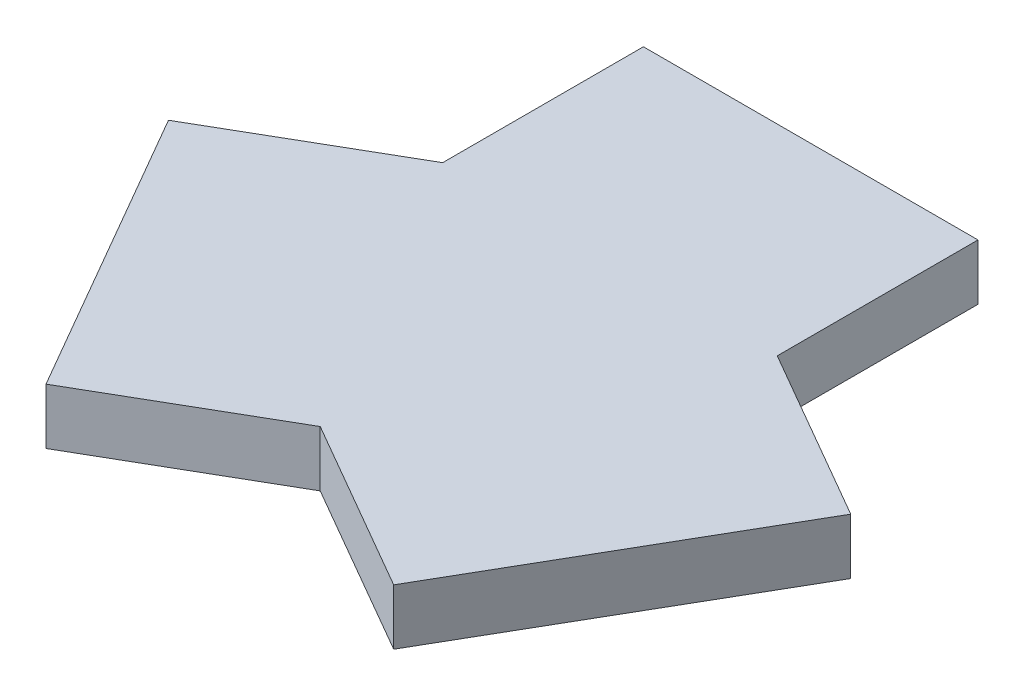
ISO-10303-21;
HEADER;
FILE_DESCRIPTION(('STEP AP214'),'2;1');
FILE_NAME('part.step','',(''),(''),'','','');
FILE_SCHEMA(('AUTOMOTIVE_DESIGN { 1 0 10303 214 1 1 1 1 }'));
ENDSEC;
DATA;
#1=APPLICATION_CONTEXT('core data for automotive mechanical design processes');
#2=APPLICATION_PROTOCOL_DEFINITION('international standard','automotive_design',2000,#1);
#3=PRODUCT_CONTEXT('',#1,'mechanical');
#4=PRODUCT('Part','Part','',(#3));
#5=PRODUCT_RELATED_PRODUCT_CATEGORY('part','',(#4));
#6=PRODUCT_DEFINITION_FORMATION('','',#4);
#7=PRODUCT_DEFINITION_CONTEXT('part definition',#1,'design');
#8=PRODUCT_DEFINITION('design','',#6,#7);
#9=PRODUCT_DEFINITION_SHAPE('','',#8);
#10=(LENGTH_UNIT() NAMED_UNIT(*) SI_UNIT(.MILLI.,.METRE.));
#11=(NAMED_UNIT(*) PLANE_ANGLE_UNIT() SI_UNIT($,.RADIAN.));
#12=(NAMED_UNIT(*) SI_UNIT($,.STERADIAN.) SOLID_ANGLE_UNIT());
#13=UNCERTAINTY_MEASURE_WITH_UNIT(LENGTH_MEASURE(1.E-05),#10,'distance_accuracy_value','');
#14=(GEOMETRIC_REPRESENTATION_CONTEXT(3) GLOBAL_UNCERTAINTY_ASSIGNED_CONTEXT((#13)) GLOBAL_UNIT_ASSIGNED_CONTEXT((#10,
#11,#12)) REPRESENTATION_CONTEXT('',''));
#15=CARTESIAN_POINT('',(0.,0.,0.));
#16=DIRECTION('',(0.,0.,1.));
#17=DIRECTION('',(1.,0.,0.));
#18=AXIS2_PLACEMENT_3D('',#15,#16,#17);
#19=CARTESIAN_POINT('',(7.50000000000006,1.25,-5.));
#20=DIRECTION('',(-1.,0.,0.));
#21=DIRECTION('',(0.,0.,1.));
#22=AXIS2_PLACEMENT_3D('',#19,#20,#21);
#23=PLANE('',#22);
#24=DIRECTION('',(0.,0.,-1.));
#25=VECTOR('',#24,1.);
#26=CARTESIAN_POINT('',(7.50000000000006,-1.25,-5.));
#27=LINE('',#26,#25);
#28=CARTESIAN_POINT('',(7.50000000000006,-1.25,-5.));
#29=VERTEX_POINT('',#28);
#30=CARTESIAN_POINT('',(7.50000000000006,-1.25,-14.));
#31=VERTEX_POINT('',#30);
#32=EDGE_CURVE('E146',#29,#31,#27,.T.);
#33=ORIENTED_EDGE('',*,*,#32,.T.);
#34=DIRECTION('',(0.,-1.,0.));
#35=VECTOR('',#34,1.);
#36=CARTESIAN_POINT('',(7.50000000000006,1.25,-14.));
#37=LINE('',#36,#35);
#38=CARTESIAN_POINT('',(7.50000000000006,1.25,-14.));
#39=VERTEX_POINT('',#38);
#40=EDGE_CURVE('E11',#39,#31,#37,.T.);
#41=ORIENTED_EDGE('',*,*,#40,.F.);
#42=DIRECTION('',(0.,0.,-1.));
#43=VECTOR('',#42,1.);
#44=CARTESIAN_POINT('',(7.50000000000006,1.25,-5.));
#45=LINE('',#44,#43);
#46=CARTESIAN_POINT('',(7.50000000000006,1.25,-5.));
#47=VERTEX_POINT('',#46);
#48=EDGE_CURVE('E171',#47,#39,#45,.T.);
#49=ORIENTED_EDGE('',*,*,#48,.F.);
#50=DIRECTION('',(0.,-1.,0.));
#51=VECTOR('',#50,1.);
#52=CARTESIAN_POINT('',(7.50000000000006,1.25,-5.));
#53=LINE('',#52,#51);
#54=EDGE_CURVE('E142',#47,#29,#53,.T.);
#55=ORIENTED_EDGE('',*,*,#54,.T.);
#56=EDGE_LOOP('',(#33,#41,#49,#55));
#57=FACE_BOUND('',#56,.T.);
#58=ADVANCED_FACE('F39',(#57),#23,.F.);
#59=CARTESIAN_POINT('',(-7.50000000000006,1.25,-14.));
#60=DIRECTION('',(0.,0.,1.));
#61=DIRECTION('',(1.,0.,0.));
#62=AXIS2_PLACEMENT_3D('',#59,#60,#61);
#63=PLANE('',#62);
#64=DIRECTION('',(-1.,0.,0.));
#65=VECTOR('',#64,1.);
#66=CARTESIAN_POINT('',(-7.50000000000006,-1.25,-14.));
#67=LINE('',#66,#65);
#68=CARTESIAN_POINT('',(-7.50000000000006,-1.25,-14.));
#69=VERTEX_POINT('',#68);
#70=EDGE_CURVE('E150',#31,#69,#67,.T.);
#71=ORIENTED_EDGE('',*,*,#70,.T.);
#72=DIRECTION('',(0.,-1.,0.));
#73=VECTOR('',#72,1.);
#74=CARTESIAN_POINT('',(-7.50000000000006,1.25,-14.));
#75=LINE('',#74,#73);
#76=CARTESIAN_POINT('',(-7.50000000000006,1.25,-14.));
#77=VERTEX_POINT('',#76);
#78=EDGE_CURVE('E48',#77,#69,#75,.T.);
#79=ORIENTED_EDGE('',*,*,#78,.F.);
#80=DIRECTION('',(-1.,0.,0.));
#81=VECTOR('',#80,1.);
#82=CARTESIAN_POINT('',(-7.50000000000006,1.25,-14.));
#83=LINE('',#82,#81);
#84=EDGE_CURVE('E102',#39,#77,#83,.T.);
#85=ORIENTED_EDGE('',*,*,#84,.F.);
#86=ORIENTED_EDGE('',*,*,#40,.T.);
#87=EDGE_LOOP('',(#71,#79,#85,#86));
#88=FACE_BOUND('',#87,.T.);
#89=ADVANCED_FACE('F227',(#88),#63,.F.);
#90=CARTESIAN_POINT('',(-7.50000000000006,1.25,-5.));
#91=DIRECTION('',(1.,0.,0.));
#92=DIRECTION('',(0.,0.,-1.));
#93=AXIS2_PLACEMENT_3D('',#90,#91,#92);
#94=PLANE('',#93);
#95=DIRECTION('',(0.,0.,1.));
#96=VECTOR('',#95,1.);
#97=CARTESIAN_POINT('',(-7.50000000000006,-1.25,-5.));
#98=LINE('',#97,#96);
#99=CARTESIAN_POINT('',(-7.50000000000006,-1.25,-5.));
#100=VERTEX_POINT('',#99);
#101=EDGE_CURVE('E153',#69,#100,#98,.T.);
#102=ORIENTED_EDGE('',*,*,#101,.T.);
#103=DIRECTION('',(0.,-1.,0.));
#104=VECTOR('',#103,1.);
#105=CARTESIAN_POINT('',(-7.50000000000006,1.25,-5.));
#106=LINE('',#105,#104);
#107=CARTESIAN_POINT('',(-7.50000000000006,1.25,-5.));
#108=VERTEX_POINT('',#107);
#109=EDGE_CURVE('E186',#108,#100,#106,.T.);
#110=ORIENTED_EDGE('',*,*,#109,.F.);
#111=DIRECTION('',(0.,0.,1.));
#112=VECTOR('',#111,1.);
#113=CARTESIAN_POINT('',(-7.50000000000006,1.25,-5.));
#114=LINE('',#113,#112);
#115=EDGE_CURVE('E196',#77,#108,#114,.T.);
#116=ORIENTED_EDGE('',*,*,#115,.F.);
#117=ORIENTED_EDGE('',*,*,#78,.T.);
#118=EDGE_LOOP('',(#102,#110,#116,#117));
#119=FACE_BOUND('',#118,.T.);
#120=ADVANCED_FACE('F194',(#119),#94,.F.);
#121=CARTESIAN_POINT('',(-15.29422863406,1.25,-0.499999999999995));
#122=DIRECTION('',(0.5,0.,0.866025403784438));
#123=DIRECTION('',(0.866025403784438,0.,-0.5));
#124=AXIS2_PLACEMENT_3D('',#121,#122,#123);
#125=PLANE('',#124);
#126=DIRECTION('',(-0.866025403784438,0.,0.5));
#127=VECTOR('',#126,1.);
#128=CARTESIAN_POINT('',(-15.29422863406,-1.25,-0.499999999999995));
#129=LINE('',#128,#127);
#130=CARTESIAN_POINT('',(-15.29422863406,-1.25,-0.499999999999995));
#131=VERTEX_POINT('',#130);
#132=EDGE_CURVE('E156',#100,#131,#129,.T.);
#133=ORIENTED_EDGE('',*,*,#132,.T.);
#134=DIRECTION('',(0.,-1.,0.));
#135=VECTOR('',#134,1.);
#136=CARTESIAN_POINT('',(-15.29422863406,1.25,-0.499999999999995));
#137=LINE('',#136,#135);
#138=CARTESIAN_POINT('',(-15.29422863406,1.25,-0.499999999999995));
#139=VERTEX_POINT('',#138);
#140=EDGE_CURVE('E182',#139,#131,#137,.T.);
#141=ORIENTED_EDGE('',*,*,#140,.F.);
#142=DIRECTION('',(-0.866025403784438,0.,0.5));
#143=VECTOR('',#142,1.);
#144=CARTESIAN_POINT('',(-15.29422863406,1.25,-0.499999999999995));
#145=LINE('',#144,#143);
#146=EDGE_CURVE('E213',#108,#139,#145,.T.);
#147=ORIENTED_EDGE('',*,*,#146,.F.);
#148=ORIENTED_EDGE('',*,*,#109,.T.);
#149=EDGE_LOOP('',(#133,#141,#147,#148));
#150=FACE_BOUND('',#149,.T.);
#151=ADVANCED_FACE('F205',(#150),#125,.F.);
#152=CARTESIAN_POINT('',(-15.29422863406,1.25,-0.499999999999995));
#153=DIRECTION('',(0.866025403784438,0.,-0.5));
#154=DIRECTION('',(-0.5,0.,-0.866025403784439));
#155=AXIS2_PLACEMENT_3D('',#152,#153,#154);
#156=PLANE('',#155);
#157=DIRECTION('',(0.5,0.,0.866025403784438));
#158=VECTOR('',#157,1.);
#159=CARTESIAN_POINT('',(-15.29422863406,-1.25,-0.499999999999995));
#160=LINE('',#159,#158);
#161=CARTESIAN_POINT('',(-7.79422863405994,-1.25,12.4903810567667));
#162=VERTEX_POINT('',#161);
#163=EDGE_CURVE('E159',#131,#162,#160,.T.);
#164=ORIENTED_EDGE('',*,*,#163,.T.);
#165=DIRECTION('',(0.,-1.,0.));
#166=VECTOR('',#165,1.);
#167=CARTESIAN_POINT('',(-7.79422863405994,1.25,12.4903810567667));
#168=LINE('',#167,#166);
#169=CARTESIAN_POINT('',(-7.79422863405994,1.25,12.4903810567667));
#170=VERTEX_POINT('',#169);
#171=EDGE_CURVE('E178',#170,#162,#168,.T.);
#172=ORIENTED_EDGE('',*,*,#171,.F.);
#173=DIRECTION('',(0.5,0.,0.866025403784438));
#174=VECTOR('',#173,1.);
#175=CARTESIAN_POINT('',(-15.29422863406,1.25,-0.499999999999995));
#176=LINE('',#175,#174);
#177=EDGE_CURVE('E211',#139,#170,#176,.T.);
#178=ORIENTED_EDGE('',*,*,#177,.F.);
#179=ORIENTED_EDGE('',*,*,#140,.T.);
#180=EDGE_LOOP('',(#164,#172,#178,#179));
#181=FACE_BOUND('',#180,.T.);
#182=ADVANCED_FACE('F209',(#181),#156,.F.);
#183=CARTESIAN_POINT('',(0.,1.25,7.99038105676669));
#184=DIRECTION('',(-0.5,0.,-0.866025403784438));
#185=DIRECTION('',(-0.866025403784439,0.,0.5));
#186=AXIS2_PLACEMENT_3D('',#183,#184,#185);
#187=PLANE('',#186);
#188=DIRECTION('',(0.866025403784439,0.,-0.5));
#189=VECTOR('',#188,1.);
#190=CARTESIAN_POINT('',(0.,-1.25,7.99038105676669));
#191=LINE('',#190,#189);
#192=CARTESIAN_POINT('',(0.,-1.25,7.99038105676669));
#193=VERTEX_POINT('',#192);
#194=EDGE_CURVE('E162',#162,#193,#191,.T.);
#195=ORIENTED_EDGE('',*,*,#194,.T.);
#196=DIRECTION('',(0.,-1.,0.));
#197=VECTOR('',#196,1.);
#198=CARTESIAN_POINT('',(0.,1.25,7.99038105676669));
#199=LINE('',#198,#197);
#200=CARTESIAN_POINT('',(0.,1.25,7.99038105676669));
#201=VERTEX_POINT('',#200);
#202=EDGE_CURVE('E135',#201,#193,#199,.T.);
#203=ORIENTED_EDGE('',*,*,#202,.F.);
#204=DIRECTION('',(0.866025403784439,0.,-0.5));
#205=VECTOR('',#204,1.);
#206=CARTESIAN_POINT('',(0.,1.25,7.99038105676669));
#207=LINE('',#206,#205);
#208=EDGE_CURVE('E124',#170,#201,#207,.T.);
#209=ORIENTED_EDGE('',*,*,#208,.F.);
#210=ORIENTED_EDGE('',*,*,#171,.T.);
#211=EDGE_LOOP('',(#195,#203,#209,#210));
#212=FACE_BOUND('',#211,.T.);
#213=ADVANCED_FACE('F239',(#212),#187,.F.);
#214=CARTESIAN_POINT('',(0.,1.25,7.99038105676669));
#215=DIRECTION('',(0.5,0.,-0.866025403784439));
#216=DIRECTION('',(-0.866025403784439,0.,-0.5));
#217=AXIS2_PLACEMENT_3D('',#214,#215,#216);
#218=PLANE('',#217);
#219=DIRECTION('',(0.866025403784439,0.,0.499999999999999));
#220=VECTOR('',#219,1.);
#221=CARTESIAN_POINT('',(0.,-1.25,7.99038105676669));
#222=LINE('',#221,#220);
#223=CARTESIAN_POINT('',(7.79422863405995,-1.25,12.4903810567667));
#224=VERTEX_POINT('',#223);
#225=EDGE_CURVE('E133',#193,#224,#222,.T.);
#226=ORIENTED_EDGE('',*,*,#225,.T.);
#227=DIRECTION('',(0.,-1.,0.));
#228=VECTOR('',#227,1.);
#229=CARTESIAN_POINT('',(7.79422863405995,1.25,12.4903810567667));
#230=LINE('',#229,#228);
#231=CARTESIAN_POINT('',(7.79422863405995,1.25,12.4903810567667));
#232=VERTEX_POINT('',#231);
#233=EDGE_CURVE('E130',#232,#224,#230,.T.);
#234=ORIENTED_EDGE('',*,*,#233,.F.);
#235=DIRECTION('',(0.866025403784439,0.,0.499999999999999));
#236=VECTOR('',#235,1.);
#237=CARTESIAN_POINT('',(0.,1.25,7.99038105676669));
#238=LINE('',#237,#236);
#239=EDGE_CURVE('E118',#201,#232,#238,.T.);
#240=ORIENTED_EDGE('',*,*,#239,.F.);
#241=ORIENTED_EDGE('',*,*,#202,.T.);
#242=EDGE_LOOP('',(#226,#234,#240,#241));
#243=FACE_BOUND('',#242,.T.);
#244=ADVANCED_FACE('F131',(#243),#218,.F.);
#245=CARTESIAN_POINT('',(15.29422863406,1.25,-0.499999999999999));
#246=DIRECTION('',(-0.866025403784439,0.,-0.5));
#247=DIRECTION('',(-0.5,0.,0.866025403784439));
#248=AXIS2_PLACEMENT_3D('',#245,#246,#247);
#249=PLANE('',#248);
#250=DIRECTION('',(0.5,0.,-0.866025403784439));
#251=VECTOR('',#250,1.);
#252=CARTESIAN_POINT('',(15.29422863406,-1.25,-0.499999999999999));
#253=LINE('',#252,#251);
#254=CARTESIAN_POINT('',(15.29422863406,-1.25,-0.499999999999999));
#255=VERTEX_POINT('',#254);
#256=EDGE_CURVE('E88',#224,#255,#253,.T.);
#257=ORIENTED_EDGE('',*,*,#256,.T.);
#258=DIRECTION('',(0.,-1.,0.));
#259=VECTOR('',#258,1.);
#260=CARTESIAN_POINT('',(15.29422863406,1.25,-0.499999999999999));
#261=LINE('',#260,#259);
#262=CARTESIAN_POINT('',(15.29422863406,1.25,-0.499999999999999));
#263=VERTEX_POINT('',#262);
#264=EDGE_CURVE('E136',#263,#255,#261,.T.);
#265=ORIENTED_EDGE('',*,*,#264,.F.);
#266=DIRECTION('',(0.5,0.,-0.866025403784439));
#267=VECTOR('',#266,1.);
#268=CARTESIAN_POINT('',(15.29422863406,1.25,-0.499999999999999));
#269=LINE('',#268,#267);
#270=EDGE_CURVE('E122',#232,#263,#269,.T.);
#271=ORIENTED_EDGE('',*,*,#270,.F.);
#272=ORIENTED_EDGE('',*,*,#233,.T.);
#273=EDGE_LOOP('',(#257,#265,#271,#272));
#274=FACE_BOUND('',#273,.T.);
#275=ADVANCED_FACE('F138',(#274),#249,.F.);
#276=CARTESIAN_POINT('',(15.29422863406,1.25,-0.499999999999999));
#277=DIRECTION('',(-0.5,0.,0.866025403784439));
#278=DIRECTION('',(0.866025403784439,0.,0.5));
#279=AXIS2_PLACEMENT_3D('',#276,#277,#278);
#280=PLANE('',#279);
#281=DIRECTION('',(-0.866025403784439,0.,-0.5));
#282=VECTOR('',#281,1.);
#283=CARTESIAN_POINT('',(15.29422863406,-1.25,-0.499999999999999));
#284=LINE('',#283,#282);
#285=EDGE_CURVE('E94',#255,#29,#284,.T.);
#286=ORIENTED_EDGE('',*,*,#285,.T.);
#287=ORIENTED_EDGE('',*,*,#54,.F.);
#288=DIRECTION('',(-0.866025403784439,0.,-0.5));
#289=VECTOR('',#288,1.);
#290=CARTESIAN_POINT('',(15.29422863406,1.25,-0.499999999999999));
#291=LINE('',#290,#289);
#292=EDGE_CURVE('E56',#263,#47,#291,.T.);
#293=ORIENTED_EDGE('',*,*,#292,.F.);
#294=ORIENTED_EDGE('',*,*,#264,.T.);
#295=EDGE_LOOP('',(#286,#287,#293,#294));
#296=FACE_BOUND('',#295,.T.);
#297=ADVANCED_FACE('F247',(#296),#280,.F.);
#298=CARTESIAN_POINT('',(0.,1.25,0.));
#299=DIRECTION('',(0.,-1.,0.));
#300=DIRECTION('',(0.,0.,-1.));
#301=AXIS2_PLACEMENT_3D('',#298,#299,#300);
#302=PLANE('',#301);
#303=ORIENTED_EDGE('',*,*,#48,.T.);
#304=ORIENTED_EDGE('',*,*,#84,.T.);
#305=ORIENTED_EDGE('',*,*,#115,.T.);
#306=ORIENTED_EDGE('',*,*,#146,.T.);
#307=ORIENTED_EDGE('',*,*,#177,.T.);
#308=ORIENTED_EDGE('',*,*,#208,.T.);
#309=ORIENTED_EDGE('',*,*,#239,.T.);
#310=ORIENTED_EDGE('',*,*,#270,.T.);
#311=ORIENTED_EDGE('',*,*,#292,.T.);
#312=EDGE_LOOP('',(#303,#304,#305,#306,#307,#308,#309,#310,#311));
#313=FACE_BOUND('',#312,.T.);
#314=ADVANCED_FACE('F120',(#313),#302,.F.);
#315=CARTESIAN_POINT('',(0.,-1.25,0.));
#316=DIRECTION('',(0.,-1.,0.));
#317=DIRECTION('',(0.,0.,-1.));
#318=AXIS2_PLACEMENT_3D('',#315,#316,#317);
#319=PLANE('',#318);
#320=ORIENTED_EDGE('',*,*,#32,.F.);
#321=ORIENTED_EDGE('',*,*,#285,.F.);
#322=ORIENTED_EDGE('',*,*,#256,.F.);
#323=ORIENTED_EDGE('',*,*,#225,.F.);
#324=ORIENTED_EDGE('',*,*,#194,.F.);
#325=ORIENTED_EDGE('',*,*,#163,.F.);
#326=ORIENTED_EDGE('',*,*,#132,.F.);
#327=ORIENTED_EDGE('',*,*,#101,.F.);
#328=ORIENTED_EDGE('',*,*,#70,.F.);
#329=EDGE_LOOP('',(#320,#321,#322,#323,#324,#325,#326,#327,#328));
#330=FACE_BOUND('',#329,.T.);
#331=ADVANCED_FACE('F200',(#330),#319,.T.);
#332=CLOSED_SHELL('',(#58,#89,#120,#151,#182,#213,#244,#275,#297,#314,#331));
#333=MANIFOLD_SOLID_BREP('B2',#332);
#334=ADVANCED_BREP_SHAPE_REPRESENTATION('',(#18,#333),#14);
#335=SHAPE_DEFINITION_REPRESENTATION(#9,#334);
ENDSEC;
END-ISO-10303-21;
